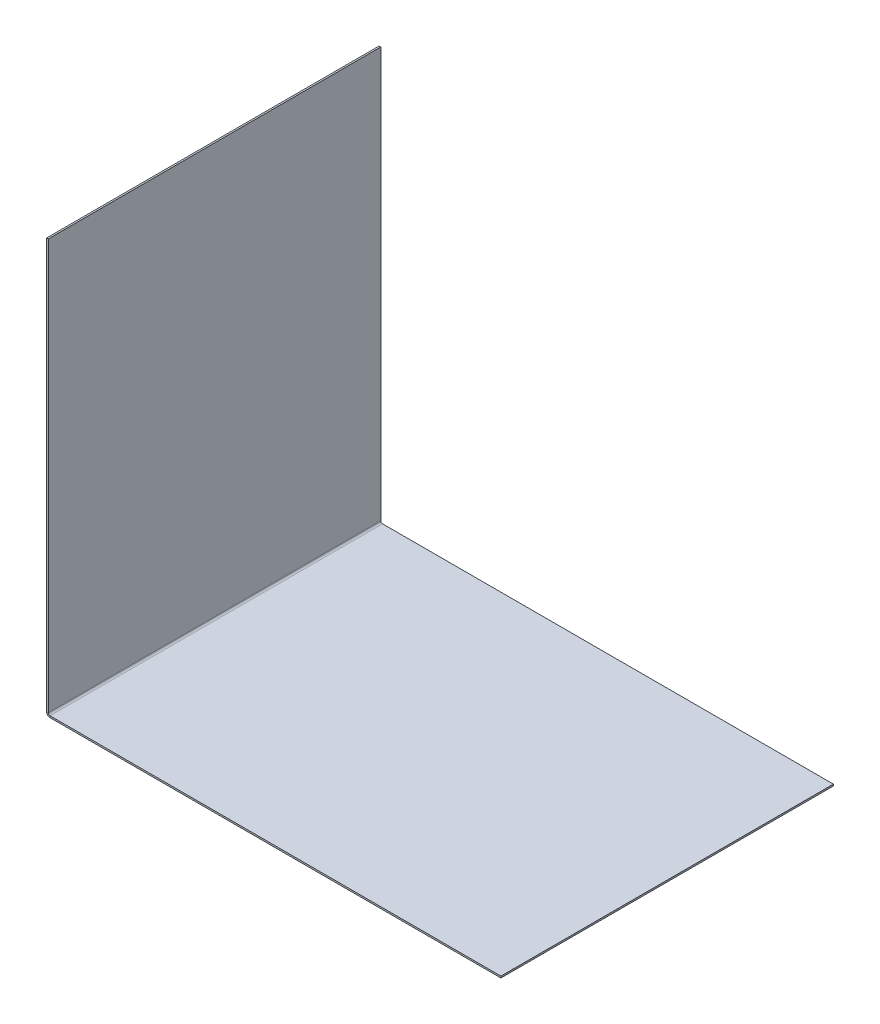
ISO-10303-21;
HEADER;
FILE_DESCRIPTION(('STEP AP214'),'2;1');
FILE_NAME('part.step','',(''),(''),'','','');
FILE_SCHEMA(('AUTOMOTIVE_DESIGN { 1 0 10303 214 1 1 1 1 }'));
ENDSEC;
DATA;
#1=APPLICATION_CONTEXT('core data for automotive mechanical design processes');
#2=APPLICATION_PROTOCOL_DEFINITION('international standard','automotive_design',2000,#1);
#3=PRODUCT_CONTEXT('',#1,'mechanical');
#4=PRODUCT('Part','Part','',(#3));
#5=PRODUCT_RELATED_PRODUCT_CATEGORY('part','',(#4));
#6=PRODUCT_DEFINITION_FORMATION('','',#4);
#7=PRODUCT_DEFINITION_CONTEXT('part definition',#1,'design');
#8=PRODUCT_DEFINITION('design','',#6,#7);
#9=PRODUCT_DEFINITION_SHAPE('','',#8);
#10=(LENGTH_UNIT() NAMED_UNIT(*) SI_UNIT(.MILLI.,.METRE.));
#11=(NAMED_UNIT(*) PLANE_ANGLE_UNIT() SI_UNIT($,.RADIAN.));
#12=(NAMED_UNIT(*) SI_UNIT($,.STERADIAN.) SOLID_ANGLE_UNIT());
#13=UNCERTAINTY_MEASURE_WITH_UNIT(LENGTH_MEASURE(1.E-05),#10,'distance_accuracy_value','');
#14=(GEOMETRIC_REPRESENTATION_CONTEXT(3) GLOBAL_UNCERTAINTY_ASSIGNED_CONTEXT((#13)) GLOBAL_UNIT_ASSIGNED_CONTEXT((#10,
#11,#12)) REPRESENTATION_CONTEXT('',''));
#15=CARTESIAN_POINT('',(0.,0.,0.));
#16=DIRECTION('',(0.,0.,1.));
#17=DIRECTION('',(1.,0.,0.));
#18=AXIS2_PLACEMENT_3D('',#15,#16,#17);
#19=CARTESIAN_POINT('',(-1.90499999999999,472.20910295359,381.));
#20=DIRECTION('',(1.,0.,0.));
#21=DIRECTION('',(0.,0.,-1.));
#22=AXIS2_PLACEMENT_3D('',#19,#20,#21);
#23=PLANE('',#22);
#24=DIRECTION('',(0.,-1.,0.));
#25=VECTOR('',#24,1.);
#26=CARTESIAN_POINT('',(-1.90499999999999,472.20910295359,0.));
#27=LINE('',#26,#25);
#28=CARTESIAN_POINT('',(-1.90499999999999,472.20910295359,0.));
#29=VERTEX_POINT('',#28);
#30=CARTESIAN_POINT('',(-1.90499999999999,2.0066,0.));
#31=VERTEX_POINT('',#30);
#32=EDGE_CURVE('E161',#29,#31,#27,.T.);
#33=ORIENTED_EDGE('',*,*,#32,.T.);
#34=DIRECTION('',(0.,0.,-1.));
#35=VECTOR('',#34,1.);
#36=CARTESIAN_POINT('',(-1.90499999999999,2.00660000000001,381.));
#37=LINE('',#36,#35);
#38=CARTESIAN_POINT('',(-1.90499999999999,2.0066,381.));
#39=VERTEX_POINT('',#38);
#40=EDGE_CURVE('E126',#39,#31,#37,.T.);
#41=ORIENTED_EDGE('',*,*,#40,.F.);
#42=DIRECTION('',(0.,-1.,0.));
#43=VECTOR('',#42,1.);
#44=CARTESIAN_POINT('',(-1.90499999999999,472.20910295359,381.));
#45=LINE('',#44,#43);
#46=CARTESIAN_POINT('',(-1.90499999999999,472.20910295359,381.));
#47=VERTEX_POINT('',#46);
#48=EDGE_CURVE('E165',#47,#39,#45,.T.);
#49=ORIENTED_EDGE('',*,*,#48,.F.);
#50=DIRECTION('',(0.,0.,-1.));
#51=VECTOR('',#50,1.);
#52=CARTESIAN_POINT('',(-1.90499999999999,472.20910295359,381.));
#53=LINE('',#52,#51);
#54=EDGE_CURVE('E168',#47,#29,#53,.T.);
#55=ORIENTED_EDGE('',*,*,#54,.T.);
#56=EDGE_LOOP('',(#33,#41,#49,#55));
#57=FACE_BOUND('',#56,.T.);
#58=ADVANCED_FACE('F38',(#57),#23,.F.);
#59=CARTESIAN_POINT('',(1210.37414675599,472.20910295359,0.));
#60=DIRECTION('',(0.,0.,-1.));
#61=DIRECTION('',(0.,1.,0.));
#62=AXIS2_PLACEMENT_3D('',#59,#60,#61);
#63=PLANE('',#62);
#64=ORIENTED_EDGE('',*,*,#32,.F.);
#65=DIRECTION('',(-1.,0.,0.));
#66=VECTOR('',#65,1.);
#67=CARTESIAN_POINT('',(1210.37414675599,472.20910295359,0.));
#68=LINE('',#67,#66);
#69=CARTESIAN_POINT('',(0.,472.20910295359,0.));
#70=VERTEX_POINT('',#69);
#71=EDGE_CURVE('E11',#70,#29,#68,.T.);
#72=ORIENTED_EDGE('',*,*,#71,.F.);
#73=DIRECTION('',(0.,-1.,0.));
#74=VECTOR('',#73,1.);
#75=CARTESIAN_POINT('',(0.,472.20910295359,0.));
#76=LINE('',#75,#74);
#77=CARTESIAN_POINT('',(0.,2.0066,0.));
#78=VERTEX_POINT('',#77);
#79=EDGE_CURVE('E170',#70,#78,#76,.T.);
#80=ORIENTED_EDGE('',*,*,#79,.T.);
#81=DIRECTION('',(-1.,0.,0.));
#82=VECTOR('',#81,1.);
#83=CARTESIAN_POINT('',(1210.37414675599,2.0066,0.));
#84=LINE('',#83,#82);
#85=EDGE_CURVE('E177',#78,#31,#84,.T.);
#86=ORIENTED_EDGE('',*,*,#85,.T.);
#87=EDGE_LOOP('',(#64,#72,#80,#86));
#88=FACE_BOUND('',#87,.T.);
#89=ADVANCED_FACE('F40',(#88),#63,.T.);
#90=CARTESIAN_POINT('',(1210.37414675599,472.20910295359,381.));
#91=DIRECTION('',(0.,1.,0.));
#92=DIRECTION('',(-1.,0.,0.));
#93=AXIS2_PLACEMENT_3D('',#90,#91,#92);
#94=PLANE('',#93);
#95=ORIENTED_EDGE('',*,*,#54,.F.);
#96=DIRECTION('',(-1.,0.,0.));
#97=VECTOR('',#96,1.);
#98=CARTESIAN_POINT('',(1210.37414675599,472.20910295359,381.));
#99=LINE('',#98,#97);
#100=CARTESIAN_POINT('',(0.,472.20910295359,381.));
#101=VERTEX_POINT('',#100);
#102=EDGE_CURVE('E46',#101,#47,#99,.T.);
#103=ORIENTED_EDGE('',*,*,#102,.F.);
#104=DIRECTION('',(0.,0.,-1.));
#105=VECTOR('',#104,1.);
#106=CARTESIAN_POINT('',(0.,472.20910295359,381.));
#107=LINE('',#106,#105);
#108=EDGE_CURVE('E52',#101,#70,#107,.T.);
#109=ORIENTED_EDGE('',*,*,#108,.T.);
#110=ORIENTED_EDGE('',*,*,#71,.T.);
#111=EDGE_LOOP('',(#95,#103,#109,#110));
#112=FACE_BOUND('',#111,.T.);
#113=ADVANCED_FACE('F183',(#112),#94,.T.);
#114=CARTESIAN_POINT('',(1210.37414675599,472.20910295359,381.));
#115=DIRECTION('',(0.,0.,-1.));
#116=DIRECTION('',(0.,1.,0.));
#117=AXIS2_PLACEMENT_3D('',#114,#115,#116);
#118=PLANE('',#117);
#119=ORIENTED_EDGE('',*,*,#102,.T.);
#120=ORIENTED_EDGE('',*,*,#48,.T.);
#121=DIRECTION('',(-1.,0.,0.));
#122=VECTOR('',#121,1.);
#123=CARTESIAN_POINT('',(1210.37414675599,2.0066,381.));
#124=LINE('',#123,#122);
#125=CARTESIAN_POINT('',(0.,2.0066,381.));
#126=VERTEX_POINT('',#125);
#127=EDGE_CURVE('E179',#126,#39,#124,.T.);
#128=ORIENTED_EDGE('',*,*,#127,.F.);
#129=DIRECTION('',(0.,-1.,0.));
#130=VECTOR('',#129,1.);
#131=CARTESIAN_POINT('',(0.,472.20910295359,381.));
#132=LINE('',#131,#130);
#133=EDGE_CURVE('E60',#101,#126,#132,.T.);
#134=ORIENTED_EDGE('',*,*,#133,.F.);
#135=EDGE_LOOP('',(#119,#120,#128,#134));
#136=FACE_BOUND('',#135,.T.);
#137=ADVANCED_FACE('F181',(#136),#118,.F.);
#138=CARTESIAN_POINT('',(0.,472.20910295359,381.));
#139=DIRECTION('',(1.,0.,0.));
#140=DIRECTION('',(0.,0.,-1.));
#141=AXIS2_PLACEMENT_3D('',#138,#139,#140);
#142=PLANE('',#141);
#143=ORIENTED_EDGE('',*,*,#79,.F.);
#144=ORIENTED_EDGE('',*,*,#108,.F.);
#145=ORIENTED_EDGE('',*,*,#133,.T.);
#146=DIRECTION('',(0.,0.,-1.));
#147=VECTOR('',#146,1.);
#148=CARTESIAN_POINT('',(0.,2.0066,381.));
#149=LINE('',#148,#147);
#150=EDGE_CURVE('E174',#126,#78,#149,.T.);
#151=ORIENTED_EDGE('',*,*,#150,.T.);
#152=EDGE_LOOP('',(#143,#144,#145,#151));
#153=FACE_BOUND('',#152,.T.);
#154=ADVANCED_FACE('F186',(#153),#142,.T.);
#155=CARTESIAN_POINT('',(518.690422538771,1283.93640414668,381.));
#156=DIRECTION('',(-1.,0.,0.));
#157=DIRECTION('',(0.,0.,1.));
#158=AXIS2_PLACEMENT_3D('',#155,#156,#157);
#159=PLANE('',#158);
#160=DIRECTION('',(0.,-1.,0.));
#161=VECTOR('',#160,1.);
#162=CARTESIAN_POINT('',(518.690422538771,1283.93640414668,381.));
#163=LINE('',#162,#161);
#164=CARTESIAN_POINT('',(518.690422538771,0.,381.));
#165=VERTEX_POINT('',#164);
#166=CARTESIAN_POINT('',(518.690422538771,-1.905,381.));
#167=VERTEX_POINT('',#166);
#168=EDGE_CURVE('E116',#165,#167,#163,.T.);
#169=ORIENTED_EDGE('',*,*,#168,.T.);
#170=DIRECTION('',(0.,0.,-1.));
#171=VECTOR('',#170,1.);
#172=CARTESIAN_POINT('',(518.690422538771,-1.905,381.));
#173=LINE('',#172,#171);
#174=CARTESIAN_POINT('',(518.690422538771,-1.90500000000005,0.));
#175=VERTEX_POINT('',#174);
#176=EDGE_CURVE('E156',#167,#175,#173,.T.);
#177=ORIENTED_EDGE('',*,*,#176,.T.);
#178=DIRECTION('',(0.,-1.,0.));
#179=VECTOR('',#178,1.);
#180=CARTESIAN_POINT('',(518.690422538771,1283.93640414668,0.));
#181=LINE('',#180,#179);
#182=CARTESIAN_POINT('',(518.690422538771,0.,0.));
#183=VERTEX_POINT('',#182);
#184=EDGE_CURVE('E133',#183,#175,#181,.T.);
#185=ORIENTED_EDGE('',*,*,#184,.F.);
#186=DIRECTION('',(0.,0.,-1.));
#187=VECTOR('',#186,1.);
#188=CARTESIAN_POINT('',(518.690422538771,0.,381.));
#189=LINE('',#188,#187);
#190=EDGE_CURVE('E150',#165,#183,#189,.T.);
#191=ORIENTED_EDGE('',*,*,#190,.F.);
#192=EDGE_LOOP('',(#169,#177,#185,#191));
#193=FACE_BOUND('',#192,.T.);
#194=ADVANCED_FACE('F201',(#193),#159,.F.);
#195=CARTESIAN_POINT('',(2.00660000000001,0.,381.));
#196=DIRECTION('',(0.,1.,0.));
#197=DIRECTION('',(0.,0.,1.));
#198=AXIS2_PLACEMENT_3D('',#195,#196,#197);
#199=PLANE('',#198);
#200=DIRECTION('',(1.,0.,0.));
#201=VECTOR('',#200,1.);
#202=CARTESIAN_POINT('',(2.00660000000001,0.,0.));
#203=LINE('',#202,#201);
#204=CARTESIAN_POINT('',(2.00660000000001,0.,0.));
#205=VERTEX_POINT('',#204);
#206=EDGE_CURVE('E142',#205,#183,#203,.T.);
#207=ORIENTED_EDGE('',*,*,#206,.F.);
#208=DIRECTION('',(0.,0.,-1.));
#209=VECTOR('',#208,1.);
#210=CARTESIAN_POINT('',(2.00660000000001,0.,381.));
#211=LINE('',#210,#209);
#212=CARTESIAN_POINT('',(2.00660000000001,0.,381.));
#213=VERTEX_POINT('',#212);
#214=EDGE_CURVE('E117',#213,#205,#211,.T.);
#215=ORIENTED_EDGE('',*,*,#214,.F.);
#216=DIRECTION('',(1.,0.,0.));
#217=VECTOR('',#216,1.);
#218=CARTESIAN_POINT('',(2.00660000000001,0.,381.));
#219=LINE('',#218,#217);
#220=EDGE_CURVE('E153',#213,#165,#219,.T.);
#221=ORIENTED_EDGE('',*,*,#220,.T.);
#222=ORIENTED_EDGE('',*,*,#190,.T.);
#223=EDGE_LOOP('',(#207,#215,#221,#222));
#224=FACE_BOUND('',#223,.T.);
#225=ADVANCED_FACE('F222',(#224),#199,.T.);
#226=CARTESIAN_POINT('',(2.00660000000001,1283.93640414668,381.));
#227=DIRECTION('',(0.,0.,-1.));
#228=DIRECTION('',(-1.,0.,0.));
#229=AXIS2_PLACEMENT_3D('',#226,#227,#228);
#230=PLANE('',#229);
#231=DIRECTION('',(0.,-1.,0.));
#232=VECTOR('',#231,1.);
#233=CARTESIAN_POINT('',(2.00660000000001,1283.93640414668,381.));
#234=LINE('',#233,#232);
#235=CARTESIAN_POINT('',(2.00660000000001,-1.905,381.));
#236=VERTEX_POINT('',#235);
#237=EDGE_CURVE('E148',#213,#236,#234,.T.);
#238=ORIENTED_EDGE('',*,*,#237,.T.);
#239=DIRECTION('',(1.,0.,0.));
#240=VECTOR('',#239,1.);
#241=CARTESIAN_POINT('',(2.00660000000001,-1.905,381.));
#242=LINE('',#241,#240);
#243=EDGE_CURVE('E136',#236,#167,#242,.T.);
#244=ORIENTED_EDGE('',*,*,#243,.T.);
#245=ORIENTED_EDGE('',*,*,#168,.F.);
#246=ORIENTED_EDGE('',*,*,#220,.F.);
#247=EDGE_LOOP('',(#238,#244,#245,#246));
#248=FACE_BOUND('',#247,.T.);
#249=ADVANCED_FACE('F230',(#248),#230,.F.);
#250=CARTESIAN_POINT('',(2.00660000000001,-1.905,381.));
#251=DIRECTION('',(0.,1.,0.));
#252=DIRECTION('',(0.,0.,1.));
#253=AXIS2_PLACEMENT_3D('',#250,#251,#252);
#254=PLANE('',#253);
#255=DIRECTION('',(1.,0.,0.));
#256=VECTOR('',#255,1.);
#257=CARTESIAN_POINT('',(2.00660000000001,-1.905,0.));
#258=LINE('',#257,#256);
#259=CARTESIAN_POINT('',(2.00660000000001,-1.905,0.));
#260=VERTEX_POINT('',#259);
#261=EDGE_CURVE('E131',#260,#175,#258,.T.);
#262=ORIENTED_EDGE('',*,*,#261,.T.);
#263=ORIENTED_EDGE('',*,*,#176,.F.);
#264=ORIENTED_EDGE('',*,*,#243,.F.);
#265=DIRECTION('',(0.,0.,-1.));
#266=VECTOR('',#265,1.);
#267=CARTESIAN_POINT('',(2.00660000000001,-1.905,381.));
#268=LINE('',#267,#266);
#269=EDGE_CURVE('E124',#236,#260,#268,.T.);
#270=ORIENTED_EDGE('',*,*,#269,.T.);
#271=EDGE_LOOP('',(#262,#263,#264,#270));
#272=FACE_BOUND('',#271,.T.);
#273=ADVANCED_FACE('F139',(#272),#254,.F.);
#274=CARTESIAN_POINT('',(2.00660000000001,1283.93640414668,0.));
#275=DIRECTION('',(0.,0.,-1.));
#276=DIRECTION('',(-1.,0.,0.));
#277=AXIS2_PLACEMENT_3D('',#274,#275,#276);
#278=PLANE('',#277);
#279=ORIENTED_EDGE('',*,*,#261,.F.);
#280=DIRECTION('',(0.,-1.,0.));
#281=VECTOR('',#280,1.);
#282=CARTESIAN_POINT('',(2.00660000000001,1283.93640414668,0.));
#283=LINE('',#282,#281);
#284=EDGE_CURVE('E104',#205,#260,#283,.T.);
#285=ORIENTED_EDGE('',*,*,#284,.F.);
#286=ORIENTED_EDGE('',*,*,#206,.T.);
#287=ORIENTED_EDGE('',*,*,#184,.T.);
#288=EDGE_LOOP('',(#279,#285,#286,#287));
#289=FACE_BOUND('',#288,.T.);
#290=ADVANCED_FACE('F132',(#289),#278,.T.);
#291=CARTESIAN_POINT('',(2.00660000000001,2.0066,0.));
#292=DIRECTION('',(0.,0.,-1.));
#293=DIRECTION('',(-1.,0.,0.));
#294=AXIS2_PLACEMENT_3D('',#291,#292,#293);
#295=PLANE('',#294);
#296=ORIENTED_EDGE('',*,*,#85,.F.);
#297=CARTESIAN_POINT('',(2.00660000000001,2.0066,0.));
#298=DIRECTION('',(0.,0.,1.));
#299=DIRECTION('',(1.,0.,0.));
#300=AXIS2_PLACEMENT_3D('',#297,#298,#299);
#301=CIRCLE('',#300,2.0066);
#302=EDGE_CURVE('E110',#78,#205,#301,.T.);
#303=ORIENTED_EDGE('',*,*,#302,.T.);
#304=ORIENTED_EDGE('',*,*,#284,.T.);
#305=CARTESIAN_POINT('',(2.00660000000001,2.0066,0.));
#306=DIRECTION('',(0.,0.,1.));
#307=DIRECTION('',(1.,0.,0.));
#308=AXIS2_PLACEMENT_3D('',#305,#306,#307);
#309=CIRCLE('',#308,3.9116);
#310=EDGE_CURVE('E108',#31,#260,#309,.T.);
#311=ORIENTED_EDGE('',*,*,#310,.F.);
#312=EDGE_LOOP('',(#296,#303,#304,#311));
#313=FACE_BOUND('',#312,.T.);
#314=ADVANCED_FACE('F107',(#313),#295,.T.);
#315=CARTESIAN_POINT('',(2.00660000000001,2.0066,381.));
#316=DIRECTION('',(0.,0.,1.));
#317=DIRECTION('',(1.,0.,0.));
#318=AXIS2_PLACEMENT_3D('',#315,#316,#317);
#319=PLANE('',#318);
#320=CARTESIAN_POINT('',(2.00660000000001,2.0066,381.));
#321=DIRECTION('',(0.,0.,1.));
#322=DIRECTION('',(1.,0.,0.));
#323=AXIS2_PLACEMENT_3D('',#320,#321,#322);
#324=CIRCLE('',#323,2.0066);
#325=EDGE_CURVE('E128',#213,#126,#324,.F.);
#326=ORIENTED_EDGE('',*,*,#325,.T.);
#327=ORIENTED_EDGE('',*,*,#127,.T.);
#328=CARTESIAN_POINT('',(2.00660000000001,2.0066,381.));
#329=DIRECTION('',(0.,0.,1.));
#330=DIRECTION('',(1.,0.,0.));
#331=AXIS2_PLACEMENT_3D('',#328,#329,#330);
#332=CIRCLE('',#331,3.9116);
#333=EDGE_CURVE('E127',#236,#39,#332,.F.);
#334=ORIENTED_EDGE('',*,*,#333,.F.);
#335=ORIENTED_EDGE('',*,*,#237,.F.);
#336=EDGE_LOOP('',(#326,#327,#334,#335));
#337=FACE_BOUND('',#336,.T.);
#338=ADVANCED_FACE('F255',(#337),#319,.T.);
#339=CARTESIAN_POINT('',(2.00660000000001,2.0066,-1061.93781107228));
#340=DIRECTION('',(0.,0.,1.));
#341=DIRECTION('',(1.,0.,0.));
#342=AXIS2_PLACEMENT_3D('',#339,#340,#341);
#343=CYLINDRICAL_SURFACE('',#342,3.9116);
#344=ORIENTED_EDGE('',*,*,#269,.F.);
#345=ORIENTED_EDGE('',*,*,#333,.T.);
#346=ORIENTED_EDGE('',*,*,#40,.T.);
#347=ORIENTED_EDGE('',*,*,#310,.T.);
#348=EDGE_LOOP('',(#344,#345,#346,#347));
#349=FACE_BOUND('',#348,.T.);
#350=ADVANCED_FACE('F121',(#349),#343,.T.);
#351=CARTESIAN_POINT('',(2.00660000000001,2.0066,-1061.93781107228));
#352=DIRECTION('',(0.,0.,1.));
#353=DIRECTION('',(1.,0.,0.));
#354=AXIS2_PLACEMENT_3D('',#351,#352,#353);
#355=CYLINDRICAL_SURFACE('',#354,2.0066);
#356=ORIENTED_EDGE('',*,*,#214,.T.);
#357=ORIENTED_EDGE('',*,*,#302,.F.);
#358=ORIENTED_EDGE('',*,*,#150,.F.);
#359=ORIENTED_EDGE('',*,*,#325,.F.);
#360=EDGE_LOOP('',(#356,#357,#358,#359));
#361=FACE_BOUND('',#360,.T.);
#362=ADVANCED_FACE('F269',(#361),#355,.F.);
#363=CLOSED_SHELL('',(#58,#89,#113,#137,#154,#194,#225,#249,#273,#290,#314,#338,#350,#362));
#364=MANIFOLD_SOLID_BREP('B2',#363);
#365=ADVANCED_BREP_SHAPE_REPRESENTATION('',(#18,#364),#14);
#366=SHAPE_DEFINITION_REPRESENTATION(#9,#365);
ENDSEC;
END-ISO-10303-21;
